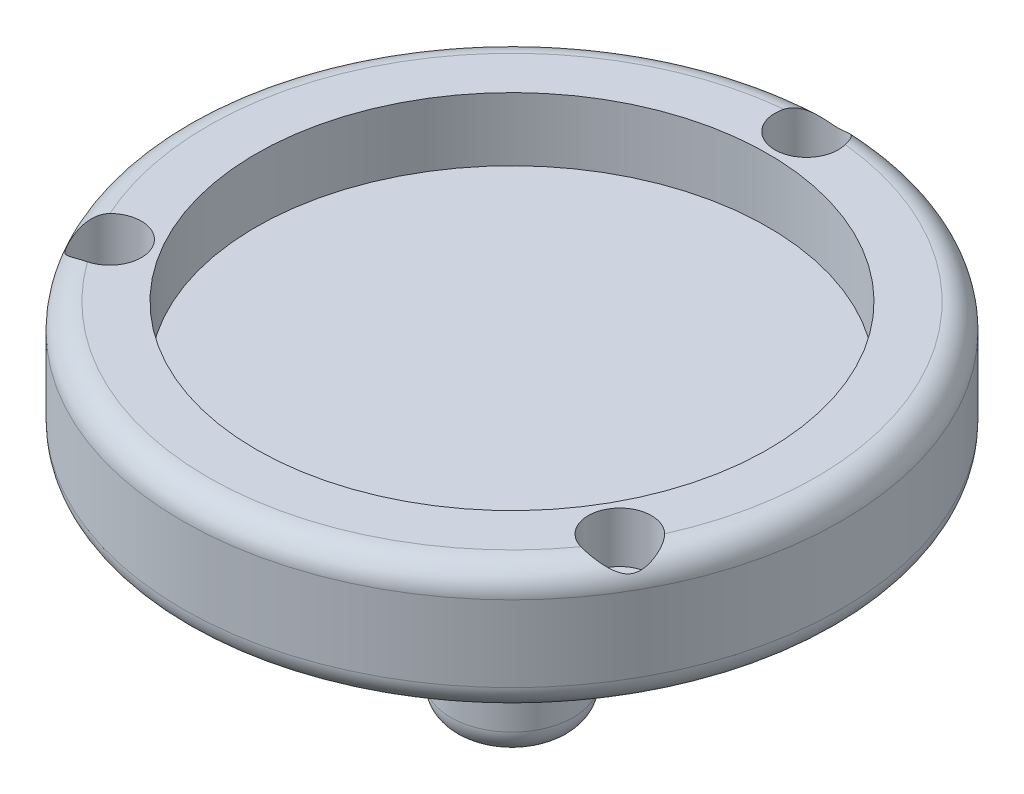
ISO-10303-21;
HEADER;
FILE_DESCRIPTION(('STEP AP214'),'2;1');
FILE_NAME('part.step','',(''),(''),'','','');
FILE_SCHEMA(('AUTOMOTIVE_DESIGN { 1 0 10303 214 1 1 1 1 }'));
ENDSEC;
DATA;
#1=APPLICATION_CONTEXT('core data for automotive mechanical design processes');
#2=APPLICATION_PROTOCOL_DEFINITION('international standard','automotive_design',2000,#1);
#3=PRODUCT_CONTEXT('',#1,'mechanical');
#4=PRODUCT('Part','Part','',(#3));
#5=PRODUCT_RELATED_PRODUCT_CATEGORY('part','',(#4));
#6=PRODUCT_DEFINITION_FORMATION('','',#4);
#7=PRODUCT_DEFINITION_CONTEXT('part definition',#1,'design');
#8=PRODUCT_DEFINITION('design','',#6,#7);
#9=PRODUCT_DEFINITION_SHAPE('','',#8);
#10=(LENGTH_UNIT() NAMED_UNIT(*) SI_UNIT(.MILLI.,.METRE.));
#11=(NAMED_UNIT(*) PLANE_ANGLE_UNIT() SI_UNIT($,.RADIAN.));
#12=(NAMED_UNIT(*) SI_UNIT($,.STERADIAN.) SOLID_ANGLE_UNIT());
#13=UNCERTAINTY_MEASURE_WITH_UNIT(LENGTH_MEASURE(1.E-05),#10,'distance_accuracy_value','');
#14=(GEOMETRIC_REPRESENTATION_CONTEXT(3) GLOBAL_UNCERTAINTY_ASSIGNED_CONTEXT((#13)) GLOBAL_UNIT_ASSIGNED_CONTEXT((#10,
#11,#12)) REPRESENTATION_CONTEXT('',''));
#15=CARTESIAN_POINT('',(0.,0.,0.));
#16=DIRECTION('',(0.,0.,1.));
#17=DIRECTION('',(1.,0.,0.));
#18=AXIS2_PLACEMENT_3D('',#15,#16,#17);
#19=CARTESIAN_POINT('',(0.,6.35,0.));
#20=DIRECTION('',(0.,-1.,0.));
#21=DIRECTION('',(0.,0.,-1.));
#22=AXIS2_PLACEMENT_3D('',#19,#20,#21);
#23=CYLINDRICAL_SURFACE('',#22,16.51);
#24=CARTESIAN_POINT('',(0.,1.27,0.));
#25=DIRECTION('',(0.,1.,0.));
#26=DIRECTION('',(0.,0.,1.));
#27=AXIS2_PLACEMENT_3D('',#24,#25,#26);
#28=CIRCLE('',#27,16.51);
#29=CARTESIAN_POINT('',(0.,1.27,16.51));
#30=VERTEX_POINT('',#29);
#31=EDGE_CURVE('E124',#30,#30,#28,.T.);
#32=ORIENTED_EDGE('',*,*,#31,.T.);
#33=EDGE_LOOP('',(#32));
#34=FACE_BOUND('',#33,.T.);
#35=CARTESIAN_POINT('',(0.,5.08,0.));
#36=DIRECTION('',(0.,1.,0.));
#37=DIRECTION('',(0.,0.,1.));
#38=AXIS2_PLACEMENT_3D('',#35,#36,#37);
#39=CIRCLE('',#38,16.51);
#40=CARTESIAN_POINT('',(0.,5.08,16.51));
#41=VERTEX_POINT('',#40);
#42=EDGE_CURVE('E103',#41,#41,#39,.F.);
#43=ORIENTED_EDGE('',*,*,#42,.T.);
#44=EDGE_LOOP('',(#43));
#45=FACE_BOUND('',#44,.T.);
#46=ADVANCED_FACE('F39',(#34,#45),#23,.T.);
#47=CARTESIAN_POINT('',(0.,6.35,0.));
#48=DIRECTION('',(0.,1.,0.));
#49=DIRECTION('',(0.,0.,1.));
#50=AXIS2_PLACEMENT_3D('',#47,#48,#49);
#51=PLANE('',#50);
#52=CARTESIAN_POINT('',(12.780046674195,6.35,7.37856338760252));
#53=DIRECTION('',(0.,1.,0.));
#54=DIRECTION('',(-0.866025403784436,0.,-0.500000000000004));
#55=AXIS2_PLACEMENT_3D('',#52,#53,#54);
#56=CIRCLE('',#55,1.5875);
#57=CARTESIAN_POINT('',(13.89855472997,6.35,6.25202178643267));
#58=VERTEX_POINT('',#57);
#59=CARTESIAN_POINT('',(12.3636870570494,6.35,8.91049057882617));
#60=VERTEX_POINT('',#59);
#61=EDGE_CURVE('E59',#58,#60,#56,.T.);
#62=ORIENTED_EDGE('',*,*,#61,.F.);
#63=CARTESIAN_POINT('',(0.,6.35,0.));
#64=DIRECTION('',(0.,1.,0.));
#65=DIRECTION('',(0.,0.,1.));
#66=AXIS2_PLACEMENT_3D('',#63,#64,#65);
#67=CIRCLE('',#66,15.24);
#68=CARTESIAN_POINT('',(1.53486767292061,6.35,-15.1625123652587));
#69=VERTEX_POINT('',#68);
#70=EDGE_CURVE('E99',#58,#69,#67,.T.);
#71=ORIENTED_EDGE('',*,*,#70,.T.);
#72=CARTESIAN_POINT('',(0.,6.35,-14.7571267752049));
#73=DIRECTION('',(0.,1.,0.));
#74=DIRECTION('',(0.,0.,1.));
#75=AXIS2_PLACEMENT_3D('',#72,#73,#74);
#76=CIRCLE('',#75,1.5875);
#77=CARTESIAN_POINT('',(-1.53486767292061,6.35,-15.1625123652587));
#78=VERTEX_POINT('',#77);
#79=EDGE_CURVE('E314',#78,#69,#76,.T.);
#80=ORIENTED_EDGE('',*,*,#79,.F.);
#81=CARTESIAN_POINT('',(-13.8985547299701,6.35,6.25202178643247));
#82=VERTEX_POINT('',#81);
#83=EDGE_CURVE('E91',#78,#82,#67,.T.);
#84=ORIENTED_EDGE('',*,*,#83,.T.);
#85=CARTESIAN_POINT('',(-12.7800466741951,6.35,7.37856338760234));
#86=DIRECTION('',(0.,1.,0.));
#87=DIRECTION('',(0.866025403784443,0.,-0.499999999999992));
#88=AXIS2_PLACEMENT_3D('',#85,#86,#87);
#89=CIRCLE('',#88,1.5875);
#90=CARTESIAN_POINT('',(-12.3636870570495,6.35,8.910490578826));
#91=VERTEX_POINT('',#90);
#92=EDGE_CURVE('E66',#91,#82,#89,.T.);
#93=ORIENTED_EDGE('',*,*,#92,.F.);
#94=EDGE_CURVE('E89',#91,#60,#67,.T.);
#95=ORIENTED_EDGE('',*,*,#94,.T.);
#96=EDGE_LOOP('',(#62,#71,#80,#84,#93,#95));
#97=FACE_BOUND('',#96,.T.);
#98=CARTESIAN_POINT('',(0.,6.35,0.));
#99=DIRECTION('',(0.,1.,0.));
#100=DIRECTION('',(0.,0.,1.));
#101=AXIS2_PLACEMENT_3D('',#98,#99,#100);
#102=CIRCLE('',#101,12.827);
#103=CARTESIAN_POINT('',(0.,6.35,12.827));
#104=VERTEX_POINT('',#103);
#105=EDGE_CURVE('E107',#104,#104,#102,.T.);
#106=ORIENTED_EDGE('',*,*,#105,.F.);
#107=EDGE_LOOP('',(#106));
#108=FACE_BOUND('',#107,.T.);
#109=ADVANCED_FACE('F87',(#97,#108),#51,.T.);
#110=CARTESIAN_POINT('',(0.,0.,0.));
#111=DIRECTION('',(0.,1.,0.));
#112=DIRECTION('',(0.,0.,1.));
#113=AXIS2_PLACEMENT_3D('',#110,#111,#112);
#114=PLANE('',#113);
#115=CARTESIAN_POINT('',(0.,0.,0.));
#116=DIRECTION('',(0.,1.,0.));
#117=DIRECTION('',(0.,0.,1.));
#118=AXIS2_PLACEMENT_3D('',#115,#116,#117);
#119=CIRCLE('',#118,15.24);
#120=CARTESIAN_POINT('',(0.,0.,15.24));
#121=VERTEX_POINT('',#120);
#122=EDGE_CURVE('E132',#121,#121,#119,.F.);
#123=ORIENTED_EDGE('',*,*,#122,.T.);
#124=EDGE_LOOP('',(#123));
#125=FACE_BOUND('',#124,.T.);
#126=CARTESIAN_POINT('',(0.,0.,0.));
#127=DIRECTION('',(0.,1.,0.));
#128=DIRECTION('',(0.,0.,1.));
#129=AXIS2_PLACEMENT_3D('',#126,#127,#128);
#130=CIRCLE('',#129,4.3434);
#131=CARTESIAN_POINT('',(0.,0.,4.3434));
#132=VERTEX_POINT('',#131);
#133=EDGE_CURVE('E128',#132,#132,#130,.T.);
#134=ORIENTED_EDGE('',*,*,#133,.T.);
#135=EDGE_LOOP('',(#134));
#136=FACE_BOUND('',#135,.T.);
#137=ADVANCED_FACE('F173',(#125,#136),#114,.F.);
#138=CARTESIAN_POINT('',(0.,3.175,0.));
#139=DIRECTION('',(0.,1.,0.));
#140=DIRECTION('',(0.,0.,1.));
#141=AXIS2_PLACEMENT_3D('',#138,#139,#140);
#142=CYLINDRICAL_SURFACE('',#141,12.827);
#143=CARTESIAN_POINT('',(0.,3.175,0.));
#144=DIRECTION('',(0.,1.,0.));
#145=DIRECTION('',(0.,0.,1.));
#146=AXIS2_PLACEMENT_3D('',#143,#144,#145);
#147=CIRCLE('',#146,12.827);
#148=CARTESIAN_POINT('',(0.,3.175,12.827));
#149=VERTEX_POINT('',#148);
#150=EDGE_CURVE('E104',#149,#149,#147,.T.);
#151=ORIENTED_EDGE('',*,*,#150,.F.);
#152=EDGE_LOOP('',(#151));
#153=FACE_BOUND('',#152,.T.);
#154=ORIENTED_EDGE('',*,*,#105,.T.);
#155=EDGE_LOOP('',(#154));
#156=FACE_BOUND('',#155,.T.);
#157=ADVANCED_FACE('F169',(#153,#156),#142,.F.);
#158=CARTESIAN_POINT('',(0.,3.175,0.));
#159=DIRECTION('',(0.,1.,0.));
#160=DIRECTION('',(0.,0.,1.));
#161=AXIS2_PLACEMENT_3D('',#158,#159,#160);
#162=PLANE('',#161);
#163=ORIENTED_EDGE('',*,*,#150,.T.);
#164=EDGE_LOOP('',(#163));
#165=FACE_BOUND('',#164,.T.);
#166=ADVANCED_FACE('F166',(#165),#162,.T.);
#167=CARTESIAN_POINT('',(0.,5.08,0.));
#168=DIRECTION('',(0.,1.,0.));
#169=DIRECTION('',(0.,0.,1.));
#170=AXIS2_PLACEMENT_3D('',#167,#168,#169);
#171=TOROIDAL_SURFACE('',#170,15.24,1.27);
#172=CARTESIAN_POINT('',(11.3727063344925,5.0798,8.11310366440576));
#173=CARTESIAN_POINT('',(11.372706479442,5.11403589882403,8.11308399126277));
#174=CARTESIAN_POINT('',(11.3734192358844,5.14826580995225,8.1144691623771));
#175=CARTESIAN_POINT('',(11.3762896439657,5.21642591009724,8.11994029689529));
#176=CARTESIAN_POINT('',(11.3784463292933,5.25035628419528,8.1240244540502));
#177=CARTESIAN_POINT('',(11.3842089896516,5.31749867670584,8.1347565741317));
#178=CARTESIAN_POINT('',(11.3878072677039,5.35071353834233,8.14139091356973));
#179=CARTESIAN_POINT('',(11.3964911151178,5.4163763232305,8.15702989954925));
#180=CARTESIAN_POINT('',(11.4015768866258,5.44882414159484,8.16603486823625));
#181=CARTESIAN_POINT('',(11.4191178795051,5.54456463189062,8.19622701891893));
#182=CARTESIAN_POINT('',(11.4338739536247,5.60646416865588,8.22062722483105));
#183=CARTESIAN_POINT('',(11.4701096368497,5.72523980183405,8.27595519534897));
#184=CARTESIAN_POINT('',(11.4916011719239,5.78210675660416,8.30689450636259));
#185=CARTESIAN_POINT('',(11.5438507949829,5.8935933073589,8.37554257840841));
#186=CARTESIAN_POINT('',(11.5751661148188,5.94775383450972,8.41357889369167));
#187=CARTESIAN_POINT('',(11.647166158042,6.04754799479185,8.49191893254162));
#188=CARTESIAN_POINT('',(11.6878447454439,6.09318717685485,8.53222115818537));
#189=CARTESIAN_POINT('',(11.7772483604543,6.17285009987052,8.61061399179455));
#190=CARTESIAN_POINT('',(11.8256172158215,6.20724318749738,8.64873106078568));
#191=CARTESIAN_POINT('',(11.9307903166754,6.26526392850045,8.72131410835895));
#192=CARTESIAN_POINT('',(11.9875826829881,6.28890655473462,8.75578511334675));
#193=CARTESIAN_POINT('',(12.099012881419,6.32214168216185,8.81372947066592));
#194=CARTESIAN_POINT('',(12.1527418614945,6.3332878483285,8.83807449510625));
#195=CARTESIAN_POINT('',(12.2635097476134,6.34748826475938,8.88085090185968));
#196=CARTESIAN_POINT('',(12.3205485692059,6.35054272139166,8.8992824349778));
#197=CARTESIAN_POINT('',(12.4341729795377,6.34932017591593,8.92900134980234));
#198=CARTESIAN_POINT('',(12.4907027220156,6.34529969574203,8.94051920627635));
#199=CARTESIAN_POINT('',(12.6039434421318,6.33139895960008,8.95730556831677));
#200=CARTESIAN_POINT('',(12.6606544815118,6.32151643352116,8.96257165047526));
#201=CARTESIAN_POINT('',(12.7961106863179,6.29195988595494,8.96795501654864));
#202=CARTESIAN_POINT('',(12.8744644535115,6.26994030843277,8.96511807761261));
#203=CARTESIAN_POINT('',(13.0277990255958,6.21920103862342,8.94851700848809));
#204=CARTESIAN_POINT('',(13.1027719568762,6.19046658153389,8.9347286354559));
#205=CARTESIAN_POINT('',(13.2695990730332,6.11976955672689,8.89181392113699));
#206=CARTESIAN_POINT('',(13.3599973794792,6.07639343444513,8.85938652099292));
#207=CARTESIAN_POINT('',(13.5327700394727,5.98747175225542,8.77951138820003));
#208=CARTESIAN_POINT('',(13.6151381274886,5.94192453897291,8.73205204770629));
#209=CARTESIAN_POINT('',(13.7460605593125,5.86921386458075,8.63995955937805));
#210=CARTESIAN_POINT('',(13.7968889644333,5.84089529837038,8.59944245201694));
#211=CARTESIAN_POINT('',(13.8945171862406,5.78936865247123,8.51100767855514));
#212=CARTESIAN_POINT('',(13.9413278591713,5.7661465189103,8.46311100011884));
#213=CARTESIAN_POINT('',(14.0177790118927,5.734599657408,8.3738525423949));
#214=CARTESIAN_POINT('',(14.0485850223939,5.72393042028649,8.33435309549567));
#215=CARTESIAN_POINT('',(14.1067694679432,5.70975846374611,8.25177468377269));
#216=CARTESIAN_POINT('',(14.134156834886,5.70623668604356,8.20870555771149));
#217=CARTESIAN_POINT('',(14.184644876331,5.70716185195011,8.12009331540923));
#218=CARTESIAN_POINT('',(14.207736588275,5.71162525464989,8.07454527729552));
#219=CARTESIAN_POINT('',(14.2490887326299,5.72750564371418,7.98241570000989));
#220=CARTESIAN_POINT('',(14.2673350590226,5.73894261993818,7.93583156208625));
#221=CARTESIAN_POINT('',(14.307885139589,5.77447475829992,7.81648466866069));
#222=CARTESIAN_POINT('',(14.3267590567423,5.80207203701078,7.74363887423819));
#223=CARTESIAN_POINT('',(14.3540300133431,5.86268593130549,7.59819583537799));
#224=CARTESIAN_POINT('',(14.3623883961279,5.89572204071376,7.52560048075421));
#225=CARTESIAN_POINT('',(14.3703189325399,5.97425775906277,7.35686374076847));
#226=CARTESIAN_POINT('',(14.3661262297123,6.02030169268154,7.26078200509495));
#227=CARTESIAN_POINT('',(14.3401431741143,6.10886076032522,7.06949422337727));
#228=CARTESIAN_POINT('',(14.3183899393258,6.15138312911937,6.97428675824069));
#229=CARTESIAN_POINT('',(14.2650797560895,6.21708552282127,6.81299389583945));
#230=CARTESIAN_POINT('',(14.2380201160408,6.2423379596779,6.74627042445876));
#231=CARTESIAN_POINT('',(14.1739982691929,6.28631375418782,6.61545367243004));
#232=CARTESIAN_POINT('',(14.1370498575003,6.30504612439591,6.55135687006102));
#233=CARTESIAN_POINT('',(14.060799646504,6.33110673135582,6.43855738981227));
#234=CARTESIAN_POINT('',(14.0230618092052,6.33986348295954,6.38913326498036));
#235=CARTESIAN_POINT('',(13.9415782949549,6.35000269341416,6.29464358540458));
#236=CARTESIAN_POINT('',(13.8978363792394,6.35138974755598,6.2495753318254));
#237=CARTESIAN_POINT('',(13.8053370197422,6.34566105735002,6.16493901712269));
#238=CARTESIAN_POINT('',(13.7565537952525,6.33849940924226,6.12540193482259));
#239=CARTESIAN_POINT('',(13.6561473852934,6.31501269492,6.05326227042807));
#240=CARTESIAN_POINT('',(13.6045248079944,6.29868958418845,6.02065821055076));
#241=CARTESIAN_POINT('',(13.5054449482992,6.25891609937741,5.96545168545586));
#242=CARTESIAN_POINT('',(13.4580274621348,6.23623254382237,5.94221600144681));
#243=CARTESIAN_POINT('',(13.3644968237113,6.18396782465338,5.90168350312835));
#244=CARTESIAN_POINT('',(13.3183838481225,6.15438573173584,5.88438748973024));
#245=CARTESIAN_POINT('',(13.2265387859798,6.08733973781084,5.85433857327992));
#246=CARTESIAN_POINT('',(13.1809585221195,6.04953931288612,5.84187758005558));
#247=CARTESIAN_POINT('',(13.0942150928541,5.96801826125198,5.82182306557274));
#248=CARTESIAN_POINT('',(13.0530557125961,5.92429263270262,5.81423368814667));
#249=CARTESIAN_POINT('',(12.9707343156006,5.82502138703615,5.80193109271714));
#250=CARTESIAN_POINT('',(12.9304425351488,5.76868158876542,5.79779671301932));
#251=CARTESIAN_POINT('',(12.8587994124516,5.65045833598393,5.79261000609714));
#252=CARTESIAN_POINT('',(12.8274421409264,5.58857859399837,5.79155563054541));
#253=CARTESIAN_POINT('',(12.7870319222845,5.48947238747834,5.79101465619252));
#254=CARTESIAN_POINT('',(12.7742980668449,5.45371495505669,5.79103542620848));
#255=CARTESIAN_POINT('',(12.7522338219916,5.38115733502569,5.79126873457456));
#256=CARTESIAN_POINT('',(12.7429030598979,5.34435726207407,5.79148125191715));
#257=CARTESIAN_POINT('',(12.7278224406278,5.26981062500361,5.7919035002148));
#258=CARTESIAN_POINT('',(12.7220931946291,5.23205987628922,5.79211320852829));
#259=CARTESIAN_POINT('',(12.7144221100984,5.15614291502679,5.79241944730056));
#260=CARTESIAN_POINT('',(12.7124836185035,5.11797636522434,5.79251587771391));
#261=CARTESIAN_POINT('',(12.7125070441582,5.0798,5.79250076324793));
#262=B_SPLINE_CURVE_WITH_KNOTS('',3,(#172,#173,#174,#175,#176,#177,#178,#179,#180,#181,#182,
#183,#184,#185,#186,#187,#188,#189,#190,#191,#192,#193,#194,#195,#196,#197,#198,#199,#200,#201,
#202,#203,#204,#205,#206,#207,#208,#209,#210,#211,#212,#213,#214,#215,#216,#217,#218,#219,#220,
#221,#222,#223,#224,#225,#226,#227,#228,#229,#230,#231,#232,#233,#234,#235,#236,#237,#238,#239,
#240,#241,#242,#243,#244,#245,#246,#247,#248,#249,#250,#251,#252,#253,#254,#255,#256,#257,#258,
#259,#260,#261),.UNSPECIFIED.,.F.,.F.,(4,2,2,2,2,2,2,2,2,2,2,2,2,2,2,2,2,2,2,2,2,2,2,2,2,2,2,2,
2,2,2,2,2,2,2,2,2,2,2,2,2,2,2,2,4),(0.,0.10266174275194,0.205254850420133,0.307307339509473,
0.409373703706885,0.612873735698409,0.816736145078286,1.0353246541934,1.25377032253265,
1.46407892401674,1.67409371121388,1.85326027471167,2.03242226876575,2.20522137976093,
2.37808745192922,2.62105956087341,2.86457103363211,3.17912184359798,3.49391614812391,
3.70615929719089,3.91780960004994,4.07085991944574,4.22350160005699,4.37645826898251,
4.52985546547397,4.76896703816389,5.00895507611625,5.32738562451596,5.64514485796347,
5.87325630370328,6.10105117162491,6.28867631680307,6.47618445671722,6.66470400031026,
6.85318332034445,7.02482795715664,7.19649572962909,7.3773302150226,7.55831831644589,
7.76562908329292,7.97280194866986,8.08653148338878,8.20024855960291,8.31461064214484,
8.42907365187629),.UNSPECIFIED.);
#263=EDGE_CURVE('E11',#60,#58,#262,.T.);
#264=ORIENTED_EDGE('',*,*,#263,.F.);
#265=ORIENTED_EDGE('',*,*,#94,.F.);
#266=CARTESIAN_POINT('',(-12.7125070441583,5.0798,5.79250076324777));
#267=CARTESIAN_POINT('',(-12.7124900791914,5.11403589882402,5.79251072534922));
#268=CARTESIAN_POINT('',(-12.7140460507862,5.14826580995225,5.79243540497786));
#269=CARTESIAN_POINT('',(-12.7202193963072,5.21642591009724,5.79218568403643));
#270=CARTESIAN_POINT('',(-12.7248347228202,5.25035628419528,5.79201134974064));
#271=CARTESIAN_POINT('',(-12.7370103416263,5.31749867670584,5.79163589996354));
#272=CARTESIAN_POINT('',(-12.7445549871432,5.35071353834234,5.79143493044769));
#273=CARTESIAN_POINT('',(-12.7624406699978,5.4163763232305,5.79113586992096));
#274=CARTESIAN_POINT('',(-12.772782087395,5.44882414159485,5.7910377929012));
#275=CARTESIAN_POINT('',(-12.8076997533207,5.54456463189062,5.79113266300094));
#276=CARTESIAN_POINT('',(-12.836208988558,5.60646416865588,5.79171169509263));
#277=CARTESIAN_POINT('',(-12.9022422581789,5.72523980183405,5.79542873203002));
#278=CARTESIAN_POINT('',(-12.9397822550294,5.78210675660416,5.79857129186379));
#279=CARTESIAN_POINT('',(-13.0253580408714,5.8935933073589,5.80949675674809));
#280=CARTESIAN_POINT('',(-13.073956116091,5.94775383450972,5.81759846161203));
#281=CARTESIAN_POINT('',(-13.1778006014801,6.04754799479185,5.84078230869193));
#282=CARTESIAN_POINT('',(-13.2330426464176,6.09318717685486,5.85585988595011));
#283=CARTESIAN_POINT('',(-13.345634639303,6.17285009987052,5.8940892709347));
#284=CARTESIAN_POINT('',(-13.4028294170507,6.20724318749738,5.91691939393914));
#285=CARTESIAN_POINT('',(-13.5182747305602,6.26526392850045,5.97171044728672));
#286=CARTESIAN_POINT('',(-13.57652367973,6.28890655473463,6.00365857676072));
#287=CARTESIAN_POINT('',(-13.6824200643898,6.32214168216185,6.071187780691));
#288=CARTESIAN_POINT('',(-13.7303679640486,6.3332878483285,6.10554593013566));
#289=CARTESIAN_POINT('',(-13.8227973620392,6.34748826475938,6.18008553006142));
#290=CARTESIAN_POINT('',(-13.8672789487464,6.35054272139166,6.22026683200335));
#291=CARTESIAN_POINT('',(-13.9498284891233,6.34932017591593,6.30380900042847));
#292=CARTESIAN_POINT('',(-13.9880681166658,6.34529969574203,6.34700626524669));
#293=CARTESIAN_POINT('',(-14.0592258926881,6.33139895960008,6.43668242459));
#294=CARTESIAN_POINT('',(-14.0921419733057,6.32151643352116,6.4831625842888));
#295=CARTESIAN_POINT('',(-14.1645322074862,6.29195988595494,6.59777941571447));
#296=CARTESIAN_POINT('',(-14.2012522298954,6.26994030843277,6.66705423805433));
#297=CARTESIAN_POINT('',(-14.2635425683457,6.21920103862342,6.80814640731998));
#298=CARTESIAN_POINT('',(-14.2890879526632,6.19046658153389,6.87996905692111));
#299=CARTESIAN_POINT('',(-14.3353362779454,6.11976955672689,7.04590293471264));
#300=CARTESIAN_POINT('',(-14.3524524788649,6.07639343444513,7.140403864626));
#301=CARTESIAN_POINT('',(-14.3696649147324,5.98747175225542,7.32996694365622));
#302=CARTESIAN_POINT('',(-14.3697479642259,5.94192453897292,7.42502947058602));
#303=CARTESIAN_POINT('',(-14.3554547457479,5.86921386458075,7.58445786663488));
#304=CARTESIAN_POINT('',(-14.3457801040457,5.84089529837038,7.6487351103839));
#305=CARTESIAN_POINT('',(-14.3180074545535,5.78936865247123,7.77750101732622));
#306=CARTESIAN_POINT('',(-14.2999330507361,5.76614651891031,7.8419885884706));
#307=CARTESIAN_POINT('',(-14.2608585352053,5.73459965740801,7.95282645773788));
#308=CARTESIAN_POINT('',(-14.2420540160057,5.7239304202865,7.99925496887077));
#309=CARTESIAN_POINT('',(-14.1996312364241,5.70975846374612,8.09093338268306));
#310=CARTESIAN_POINT('',(-14.1760259626077,5.70623668604356,8.13618610122895));
#311=CARTESIAN_POINT('',(-14.1245295304101,5.70716185195012,8.22421614885871));
#312=CARTESIAN_POINT('',(-14.0966296282831,5.7116252546499,8.266988177076));
#313=CARTESIAN_POINT('',(-14.0375191460913,5.72750564371418,8.34886497323108));
#314=CARTESIAN_POINT('',(-14.0062992624324,5.73894261993819,8.38795882437472));
#315=CARTESIAN_POINT('',(-13.9232168611463,5.77447475829993,8.48274967098353));
#316=CARTESIAN_POINT('',(-13.8695675111942,5.80207203701079,8.53551785991845));
#317=CARTESIAN_POINT('',(-13.757245623038,5.8626859313055,8.63185672055036));
#318=CARTESIAN_POINT('',(-13.6985553931295,5.89572204071377,8.67539296968846));
#319=CARTESIAN_POINT('',(-13.5563903579561,5.97425775906278,8.7666293856797));
#320=CARTESIAN_POINT('',(-13.4710847826093,6.02030169268155,8.81103926635726));
#321=CARTESIAN_POINT('',(-13.2924331764092,6.10886076032522,8.88418117100031));
#322=CARTESIAN_POINT('',(-13.1991044755768,6.15138312911938,8.91294604962724));
#323=CARTESIAN_POINT('',(-13.03276566767,6.21708552282128,8.94742450786484));
#324=CARTESIAN_POINT('',(-12.9614516264014,6.24233795967791,8.95735190785579));
#325=CARTESIAN_POINT('',(-12.81615007248,6.28631375418782,8.96731573810267));
#326=CARTESIAN_POINT('',(-12.7421664074807,6.30504612439591,8.96736587613188));
#327=CARTESIAN_POINT('',(-12.6063540865535,6.33110673135582,8.95773099648956));
#328=CARTESIAN_POINT('',(-12.5446826202398,6.33986348295954,8.94976113312079));
#329=CARTESIAN_POINT('',(-12.4221104002066,6.35000269341416,8.92643917957829));
#330=CARTESIAN_POINT('',(-12.3612091898451,6.35138974755598,8.91109169614809));
#331=CARTESIAN_POINT('',(-12.2416623114813,6.34566105735002,8.87330305834113));
#332=CARTESIAN_POINT('',(-12.183030581573,6.33849940924226,8.85082408780457));
#333=CARTESIAN_POINT('',(-12.0703525946073,6.31501269492,8.79993941827443));
#334=CARTESIAN_POINT('',(-12.0163053618375,6.29868958418845,8.77153498486333));
#335=CARTESIAN_POINT('',(-11.9189551788031,6.2589160993774,8.71333257191136));
#336=CARTESIAN_POINT('',(-11.8751237430947,6.23623254382236,8.68388566631387));
#337=CARTESIAN_POINT('',(-11.7932562506604,6.18396782465337,8.62315200656619));
#338=CARTESIAN_POINT('',(-11.755220975879,6.15438573173583,8.59186500496123));
#339=CARTESIAN_POINT('',(-11.6832753198055,6.08733973781083,8.52734930615869));
#340=CARTESIAN_POINT('',(-11.6496936511867,6.04953931288611,8.49410613635659));
#341=CARTESIAN_POINT('',(-11.5889542175513,5.96801826125197,8.42901138024286));
#342=CARTESIAN_POINT('',(-11.5618019337724,5.92429263270261,8.39716100004841));
#343=CARTESIAN_POINT('',(-11.5099868751002,5.82502138703614,8.33201987669009));
#344=CARTESIAN_POINT('',(-11.4862605070271,5.76868158876541,8.29919336110398));
#345=CARTESIAN_POINT('',(-11.4459471257219,5.65045833598391,8.2397419503029));
#346=CARTESIAN_POINT('',(-11.4293553739464,5.58857859399835,8.21311294434457));
#347=CARTESIAN_POINT('',(-11.408681767093,5.48947238747833,8.17838715560465));
#348=CARTESIAN_POINT('',(-11.4023328267347,5.45371495505668,8.16734892829782));
#349=CARTESIAN_POINT('',(-11.3915027552799,5.38115733502568,8.14812407755648));
#350=CARTESIAN_POINT('',(-11.3870214196505,5.34435726207406,8.1399371418754));
#351=CARTESIAN_POINT('',(-11.379846787768,5.26981062500361,8.12666581833392));
#352=CARTESIAN_POINT('',(-11.3771637774955,5.23205987628922,8.12159929159774));
#353=CARTESIAN_POINT('',(-11.3735934457865,5.15614291502679,8.11480281813342));
#354=CARTESIAN_POINT('',(-11.3727077111767,5.11797636522434,8.11307581996055));
#355=CARTESIAN_POINT('',(-11.3727063344926,5.0798,8.11310366440562));
#356=B_SPLINE_CURVE_WITH_KNOTS('',3,(#266,#267,#268,#269,#270,#271,#272,#273,#274,#275,#276,
#277,#278,#279,#280,#281,#282,#283,#284,#285,#286,#287,#288,#289,#290,#291,#292,#293,#294,#295,
#296,#297,#298,#299,#300,#301,#302,#303,#304,#305,#306,#307,#308,#309,#310,#311,#312,#313,#314,
#315,#316,#317,#318,#319,#320,#321,#322,#323,#324,#325,#326,#327,#328,#329,#330,#331,#332,#333,
#334,#335,#336,#337,#338,#339,#340,#341,#342,#343,#344,#345,#346,#347,#348,#349,#350,#351,#352,
#353,#354,#355),.UNSPECIFIED.,.F.,.F.,(4,2,2,2,2,2,2,2,2,2,2,2,2,2,2,2,2,2,2,2,2,2,2,2,2,2,2,2,
2,2,2,2,2,2,2,2,2,2,2,2,2,2,2,2,4),(0.,0.102661742751939,0.205254850420133,0.307307339509475,
0.409373703706886,0.612873735698406,0.816736145078287,1.0353246541934,1.25377032253266,
1.46407892401674,1.67409371121389,1.85326027471168,2.03242226876575,2.20522137976093,
2.37808745192923,2.62105956087341,2.86457103363211,3.17912184359798,3.49391614812391,
3.70615929719089,3.91780960004994,4.07085991944574,4.22350160005699,4.37645826898251,
4.52985546547397,4.7689670381639,5.00895507611626,5.32738562451596,5.64514485796348,
5.87325630370328,6.10105117162491,6.28867631680307,6.47618445671722,6.66470400031026,
6.85318332034445,7.02482795715664,7.19649572962909,7.3773302150226,7.55831831644589,
7.76562908329292,7.97280194866986,8.08653148338878,8.2002485596029,8.31461064214482,
8.42907365187627),.UNSPECIFIED.);
#357=EDGE_CURVE('E54',#82,#91,#356,.T.);
#358=ORIENTED_EDGE('',*,*,#357,.F.);
#359=ORIENTED_EDGE('',*,*,#83,.F.);
#360=CARTESIAN_POINT('',(1.3398007096657,5.0798,-13.9056044276536));
#361=CARTESIAN_POINT('',(1.33978359974934,5.11403589882402,-13.9055947166121));
#362=CARTESIAN_POINT('',(1.34062681490175,5.14826580995225,-13.906904567355));
#363=CARTESIAN_POINT('',(1.34392975234136,5.21642591009724,-13.9121259809318));
#364=CARTESIAN_POINT('',(1.34638839352676,5.25035628419528,-13.9160358037909));
#365=CARTESIAN_POINT('',(1.35280135197467,5.31749867670584,-13.9263924740953));
#366=CARTESIAN_POINT('',(1.35674771943918,5.35071353834234,-13.9328258440175));
#367=CARTESIAN_POINT('',(1.36594955487992,5.4163763232305,-13.9481657694703));
#368=CARTESIAN_POINT('',(1.37120520076916,5.44882414159484,-13.9570726611375));
#369=CARTESIAN_POINT('',(1.3885818738156,5.54456463189062,-13.9873596819199));
#370=CARTESIAN_POINT('',(1.40233503493324,5.60646416865588,-14.0123389199237));
#371=CARTESIAN_POINT('',(1.43213262132909,5.72523980183405,-14.0713839273791));
#372=CARTESIAN_POINT('',(1.44818108310537,5.78210675660416,-14.1054657982265));
#373=CARTESIAN_POINT('',(1.4815072458884,5.8935933073589,-14.1850393351566));
#374=CARTESIAN_POINT('',(1.49879000127208,5.94775383450972,-14.2311773553038));
#375=CARTESIAN_POINT('',(1.53063444343799,6.04754799479185,-14.3327012412336));
#376=CARTESIAN_POINT('',(1.54519790097361,6.09318717685486,-14.3880810441356));
#377=CARTESIAN_POINT('',(1.56838627884861,6.17285009987052,-14.5047032627293));
#378=CARTESIAN_POINT('',(1.57721220122911,6.20724318749738,-14.5656504547249));
#379=CARTESIAN_POINT('',(1.58748441388473,6.26526392850045,-14.6930245556457));
#380=CARTESIAN_POINT('',(1.58894099674176,6.28890655473462,-14.7594436901075));
#381=CARTESIAN_POINT('',(1.58340718297069,6.32214168216185,-14.884917251357));
#382=CARTESIAN_POINT('',(1.57762610255401,6.3332878483285,-14.943620425242));
#383=CARTESIAN_POINT('',(1.55928761442564,6.34748826475938,-15.0609364319212));
#384=CARTESIAN_POINT('',(1.5467303795404,6.35054272139166,-15.1195492669812));
#385=CARTESIAN_POINT('',(1.51565550958544,6.34932017591593,-15.2328103502309));
#386=CARTESIAN_POINT('',(1.49736539465015,6.34529969574203,-15.2875254715231));
#387=CARTESIAN_POINT('',(1.45528245055614,6.33139895960008,-15.3939879929068));
#388=CARTESIAN_POINT('',(1.43148749179384,6.32151643352116,-15.4457342347641));
#389=CARTESIAN_POINT('',(1.36842152116818,6.29195988595494,-15.5657344322632));
#390=CARTESIAN_POINT('',(1.32678777638381,6.26994030843277,-15.632172315667));
#391=CARTESIAN_POINT('',(1.23574354274985,6.21920103862341,-15.7566634158081));
#392=CARTESIAN_POINT('',(1.18631599578691,6.19046658153389,-15.8146976923771));
#393=CARTESIAN_POINT('',(1.06573720491207,6.11976955672689,-15.9377168558497));
#394=CARTESIAN_POINT('',(0.992455099385622,6.07639343444513,-15.999790385619));
#395=CARTESIAN_POINT('',(0.836894875259579,5.98747175225542,-16.1094783318563));
#396=CARTESIAN_POINT('',(0.754609836737192,5.94192453897292,-16.1570815182924));
#397=CARTESIAN_POINT('',(0.609394186435253,5.86921386458075,-16.224417426013));
#398=CARTESIAN_POINT('',(0.548891139612271,5.84089529837038,-16.2481775624009));
#399=CARTESIAN_POINT('',(0.423490268312784,5.78936865247123,-16.2885086958814));
#400=CARTESIAN_POINT('',(0.358605191564701,5.76614651891031,-16.3050995885895));
#401=CARTESIAN_POINT('',(0.243079523312468,5.73459965740801,-16.3266790001328));
#402=CARTESIAN_POINT('',(0.193468993611708,5.7239304202865,-16.3336080643665));
#403=CARTESIAN_POINT('',(0.0928617684807913,5.70975846374612,-16.3427080664558));
#404=CARTESIAN_POINT('',(0.0418691277215677,5.70623668604356,-16.3448916589405));
#405=CARTESIAN_POINT('',(-0.0601153459209597,5.70716185195012,-16.344309464268));
#406=CARTESIAN_POINT('',(-0.111106959992009,5.7116252546499,-16.3415334543716));
#407=CARTESIAN_POINT('',(-0.211569586538715,5.72750564371418,-16.331280673241));
#408=CARTESIAN_POINT('',(-0.26103579659033,5.73894261993818,-16.323790386461));
#409=CARTESIAN_POINT('',(-0.384668278442833,5.77447475829993,-16.2992343396443));
#410=CARTESIAN_POINT('',(-0.45719154554822,5.80207203701078,-16.2791567341567));
#411=CARTESIAN_POINT('',(-0.596784390305173,5.8626859313055,-16.2300525559284));
#412=CARTESIAN_POINT('',(-0.663833002998515,5.89572204071377,-16.2009934504427));
#413=CARTESIAN_POINT('',(-0.813928574583902,5.97425775906278,-16.1234931264482));
#414=CARTESIAN_POINT('',(-0.89504144710308,6.02030169268155,-16.0718212714523));
#415=CARTESIAN_POINT('',(-1.04770999770518,6.10886076032522,-15.9536753943776));
#416=CARTESIAN_POINT('',(-1.11928546374911,6.15138312911938,-15.887232807868));
#417=CARTESIAN_POINT('',(-1.23231408841955,6.21708552282127,-15.7604184037043));
#418=CARTESIAN_POINT('',(-1.27656848963959,6.24233795967791,-15.7036223323146));
#419=CARTESIAN_POINT('',(-1.35784819671307,6.28631375418782,-15.5827694105327));
#420=CARTESIAN_POINT('',(-1.39488345001968,6.30504612439591,-15.5187227461929));
#421=CARTESIAN_POINT('',(-1.45444555995065,6.33110673135582,-15.3962883863019));
#422=CARTESIAN_POINT('',(-1.47837918896545,6.33986348295954,-15.3388943981012));
#423=CARTESIAN_POINT('',(-1.51946789474837,6.35000269341416,-15.2210827649829));
#424=CARTESIAN_POINT('',(-1.53662718939441,6.35138974755598,-15.1606670279735));
#425=CARTESIAN_POINT('',(-1.56367470826107,6.34566105735002,-15.0382420754639));
#426=CARTESIAN_POINT('',(-1.57352321367962,6.33849940924226,-14.9762260226272));
#427=CARTESIAN_POINT('',(-1.58579479068619,6.31501269492,-14.8532016887025));
#428=CARTESIAN_POINT('',(-1.58821944615696,6.29868958418845,-14.7921931954141));
#429=CARTESIAN_POINT('',(-1.58648976949621,6.2589160993774,-14.6787842573673));
#430=CARTESIAN_POINT('',(-1.58290371904013,6.23623254382236,-14.6261016677607));
#431=CARTESIAN_POINT('',(-1.57124057305103,6.18396782465337,-14.5248355096946));
#432=CARTESIAN_POINT('',(-1.56316287224357,6.15438573173583,-14.4762524946915));
#433=CARTESIAN_POINT('',(-1.54326346617442,6.08733973781083,-14.3816878794386));
#434=CARTESIAN_POINT('',(-1.5312648709329,6.04953931288611,-14.3359837164122));
#435=CARTESIAN_POINT('',(-1.50526087530294,5.96801826125196,-14.2508344458156));
#436=CARTESIAN_POINT('',(-1.4912537788238,5.92429263270261,-14.2113946881951));
#437=CARTESIAN_POINT('',(-1.46074744050054,5.82502138703614,-14.1339509694073));
#438=CARTESIAN_POINT('',(-1.4441820281218,5.76868158876541,-14.0969900741233));
#439=CARTESIAN_POINT('',(-1.41285228672982,5.65045833598391,-14.0323519564001));
#440=CARTESIAN_POINT('',(-1.39808676698015,5.58857859399835,-14.00466857489));
#441=CARTESIAN_POINT('',(-1.3783501551916,5.48947238747832,-13.9694018117972));
#442=CARTESIAN_POINT('',(-1.37196524011032,5.45371495505668,-13.9583843545063));
#443=CARTESIAN_POINT('',(-1.36073106671172,5.38115733502568,-13.9393928121311));
#444=CARTESIAN_POINT('',(-1.35588164024746,5.34435726207406,-13.9314183937926));
#445=CARTESIAN_POINT('',(-1.34797565285996,5.2698106250036,-13.9185693185488));
#446=CARTESIAN_POINT('',(-1.34492941713373,5.23205987628922,-13.9137125001261));
#447=CARTESIAN_POINT('',(-1.34082866431196,5.15614291502679,-13.907222265434));
#448=CARTESIAN_POINT('',(-1.33977590732686,5.11797636522434,-13.9055916976745));
#449=CARTESIAN_POINT('',(-1.33980070966571,5.0798,-13.9056044276536));
#450=B_SPLINE_CURVE_WITH_KNOTS('',3,(#360,#361,#362,#363,#364,#365,#366,#367,#368,#369,#370,
#371,#372,#373,#374,#375,#376,#377,#378,#379,#380,#381,#382,#383,#384,#385,#386,#387,#388,#389,
#390,#391,#392,#393,#394,#395,#396,#397,#398,#399,#400,#401,#402,#403,#404,#405,#406,#407,#408,
#409,#410,#411,#412,#413,#414,#415,#416,#417,#418,#419,#420,#421,#422,#423,#424,#425,#426,#427,
#428,#429,#430,#431,#432,#433,#434,#435,#436,#437,#438,#439,#440,#441,#442,#443,#444,#445,#446,
#447,#448,#449),.UNSPECIFIED.,.F.,.F.,(4,2,2,2,2,2,2,2,2,2,2,2,2,2,2,2,2,2,2,2,2,2,2,2,2,2,2,2,
2,2,2,2,2,2,2,2,2,2,2,2,2,2,2,2,4),(0.,0.102661742751939,0.205254850420132,0.307307339509475,
0.409373703706885,0.612873735698406,0.816736145078286,1.0353246541934,1.25377032253265,
1.46407892401674,1.67409371121389,1.85326027471167,2.03242226876575,2.20522137976093,
2.37808745192923,2.62105956087341,2.86457103363212,3.17912184359798,3.49391614812391,
3.70615929719089,3.91780960004994,4.07085991944574,4.22350160005699,4.37645826898251,
4.52985546547397,4.76896703816389,5.00895507611626,5.32738562451596,5.64514485796348,
5.87325630370328,6.10105117162491,6.28867631680307,6.47618445671722,6.66470400031027,
6.85318332034445,7.02482795715665,7.1964957296291,7.37733021502261,7.55831831644589,
7.76562908329293,7.97280194866987,8.08653148338879,8.20024855960291,8.31461064214483,
8.42907365187628),.UNSPECIFIED.);
#451=EDGE_CURVE('E84',#69,#78,#450,.T.);
#452=ORIENTED_EDGE('',*,*,#451,.F.);
#453=ORIENTED_EDGE('',*,*,#70,.F.);
#454=EDGE_LOOP('',(#264,#265,#358,#359,#452,#453));
#455=FACE_BOUND('',#454,.T.);
#456=ORIENTED_EDGE('',*,*,#42,.F.);
#457=EDGE_LOOP('',(#456));
#458=FACE_BOUND('',#457,.T.);
#459=ADVANCED_FACE('F95',(#455,#458),#171,.T.);
#460=CARTESIAN_POINT('',(0.,-11.43,0.));
#461=DIRECTION('',(0.,1.,0.));
#462=DIRECTION('',(0.,0.,1.));
#463=AXIS2_PLACEMENT_3D('',#460,#461,#462);
#464=CYLINDRICAL_SURFACE('',#463,3.0734);
#465=CARTESIAN_POINT('',(0.,-10.16,0.));
#466=DIRECTION('',(0.,-1.,0.));
#467=DIRECTION('',(0.,0.,-1.));
#468=AXIS2_PLACEMENT_3D('',#465,#466,#467);
#469=CIRCLE('',#468,3.0734);
#470=CARTESIAN_POINT('',(0.,-10.16,-3.0734));
#471=VERTEX_POINT('',#470);
#472=EDGE_CURVE('E120',#471,#471,#469,.F.);
#473=ORIENTED_EDGE('',*,*,#472,.T.);
#474=EDGE_LOOP('',(#473));
#475=FACE_BOUND('',#474,.T.);
#476=CARTESIAN_POINT('',(0.,-1.27,0.));
#477=DIRECTION('',(0.,1.,0.));
#478=DIRECTION('',(0.,0.,1.));
#479=AXIS2_PLACEMENT_3D('',#476,#477,#478);
#480=CIRCLE('',#479,3.0734);
#481=CARTESIAN_POINT('',(0.,-1.27,3.0734));
#482=VERTEX_POINT('',#481);
#483=EDGE_CURVE('E116',#482,#482,#480,.F.);
#484=ORIENTED_EDGE('',*,*,#483,.T.);
#485=EDGE_LOOP('',(#484));
#486=FACE_BOUND('',#485,.T.);
#487=ADVANCED_FACE('F161',(#475,#486),#464,.T.);
#488=CARTESIAN_POINT('',(0.,-11.43,0.));
#489=DIRECTION('',(0.,-1.,0.));
#490=DIRECTION('',(0.,0.,-1.));
#491=AXIS2_PLACEMENT_3D('',#488,#489,#490);
#492=PLANE('',#491);
#493=CARTESIAN_POINT('',(0.,-11.43,0.));
#494=DIRECTION('',(0.,-1.,0.));
#495=DIRECTION('',(0.,0.,-1.));
#496=AXIS2_PLACEMENT_3D('',#493,#494,#495);
#497=CIRCLE('',#496,1.8034);
#498=CARTESIAN_POINT('',(0.,-11.43,-1.8034));
#499=VERTEX_POINT('',#498);
#500=EDGE_CURVE('E112',#499,#499,#497,.T.);
#501=ORIENTED_EDGE('',*,*,#500,.T.);
#502=EDGE_LOOP('',(#501));
#503=FACE_BOUND('',#502,.T.);
#504=ADVANCED_FACE('F157',(#503),#492,.T.);
#505=CARTESIAN_POINT('',(0.,-10.16,0.));
#506=DIRECTION('',(0.,-1.,0.));
#507=DIRECTION('',(0.,0.,-1.));
#508=AXIS2_PLACEMENT_3D('',#505,#506,#507);
#509=TOROIDAL_SURFACE('',#508,1.8034,1.27);
#510=ORIENTED_EDGE('',*,*,#472,.F.);
#511=EDGE_LOOP('',(#510));
#512=FACE_BOUND('',#511,.T.);
#513=ORIENTED_EDGE('',*,*,#500,.F.);
#514=EDGE_LOOP('',(#513));
#515=FACE_BOUND('',#514,.T.);
#516=ADVANCED_FACE('F160',(#512,#515),#509,.T.);
#517=CARTESIAN_POINT('',(0.,1.27,0.));
#518=DIRECTION('',(0.,1.,0.));
#519=DIRECTION('',(0.,0.,1.));
#520=AXIS2_PLACEMENT_3D('',#517,#518,#519);
#521=TOROIDAL_SURFACE('',#520,15.24,1.27);
#522=ORIENTED_EDGE('',*,*,#122,.F.);
#523=EDGE_LOOP('',(#522));
#524=FACE_BOUND('',#523,.T.);
#525=ORIENTED_EDGE('',*,*,#31,.F.);
#526=EDGE_LOOP('',(#525));
#527=FACE_BOUND('',#526,.T.);
#528=ADVANCED_FACE('F208',(#524,#527),#521,.T.);
#529=CARTESIAN_POINT('',(0.,-1.27,0.));
#530=DIRECTION('',(0.,1.,0.));
#531=DIRECTION('',(0.,0.,1.));
#532=AXIS2_PLACEMENT_3D('',#529,#530,#531);
#533=TOROIDAL_SURFACE('',#532,4.3434,1.27);
#534=ORIENTED_EDGE('',*,*,#133,.F.);
#535=EDGE_LOOP('',(#534));
#536=FACE_BOUND('',#535,.T.);
#537=ORIENTED_EDGE('',*,*,#483,.F.);
#538=EDGE_LOOP('',(#537));
#539=FACE_BOUND('',#538,.T.);
#540=ADVANCED_FACE('F41',(#536,#539),#533,.F.);
#541=CARTESIAN_POINT('',(0.,3.81,-14.7571267752049));
#542=DIRECTION('',(0.,1.,0.));
#543=DIRECTION('',(0.,0.,1.));
#544=AXIS2_PLACEMENT_3D('',#541,#542,#543);
#545=CYLINDRICAL_SURFACE('',#544,1.5875);
#546=ORIENTED_EDGE('',*,*,#451,.T.);
#547=ORIENTED_EDGE('',*,*,#79,.T.);
#548=EDGE_LOOP('',(#546,#547));
#549=FACE_BOUND('',#548,.T.);
#550=CARTESIAN_POINT('',(0.,3.81,-14.7571267752049));
#551=DIRECTION('',(0.,1.,0.));
#552=DIRECTION('',(0.,0.,1.));
#553=AXIS2_PLACEMENT_3D('',#550,#551,#552);
#554=CIRCLE('',#553,1.5875);
#555=CARTESIAN_POINT('',(0.,3.81,-13.1696267752049));
#556=VERTEX_POINT('',#555);
#557=EDGE_CURVE('E319',#556,#556,#554,.T.);
#558=ORIENTED_EDGE('',*,*,#557,.F.);
#559=EDGE_LOOP('',(#558));
#560=FACE_BOUND('',#559,.T.);
#561=ADVANCED_FACE('F150',(#549,#560),#545,.F.);
#562=CARTESIAN_POINT('',(0.,3.81,-14.7571267752049));
#563=DIRECTION('',(0.,1.,0.));
#564=DIRECTION('',(0.,0.,1.));
#565=AXIS2_PLACEMENT_3D('',#562,#563,#564);
#566=PLANE('',#565);
#567=ORIENTED_EDGE('',*,*,#557,.T.);
#568=EDGE_LOOP('',(#567));
#569=FACE_BOUND('',#568,.T.);
#570=ADVANCED_FACE('F155',(#569),#566,.T.);
#571=CARTESIAN_POINT('',(-12.7800466741951,3.81,7.37856338760234));
#572=DIRECTION('',(0.,1.,0.));
#573=DIRECTION('',(0.,0.,1.));
#574=AXIS2_PLACEMENT_3D('',#571,#572,#573);
#575=CYLINDRICAL_SURFACE('',#574,1.5875);
#576=ORIENTED_EDGE('',*,*,#357,.T.);
#577=ORIENTED_EDGE('',*,*,#92,.T.);
#578=EDGE_LOOP('',(#576,#577));
#579=FACE_BOUND('',#578,.T.);
#580=CARTESIAN_POINT('',(-12.7800466741951,3.81,7.37856338760234));
#581=DIRECTION('',(0.,1.,0.));
#582=DIRECTION('',(0.866025403784443,0.,-0.499999999999992));
#583=AXIS2_PLACEMENT_3D('',#580,#581,#582);
#584=CIRCLE('',#583,1.5875);
#585=CARTESIAN_POINT('',(-11.4052313456872,3.81,6.58481338760235));
#586=VERTEX_POINT('',#585);
#587=EDGE_CURVE('E93',#586,#586,#584,.T.);
#588=ORIENTED_EDGE('',*,*,#587,.F.);
#589=EDGE_LOOP('',(#588));
#590=FACE_BOUND('',#589,.T.);
#591=ADVANCED_FACE('F77',(#579,#590),#575,.F.);
#592=CARTESIAN_POINT('',(-12.7800466741951,3.81,7.37856338760234));
#593=DIRECTION('',(0.,1.,0.));
#594=DIRECTION('',(0.866025403784443,0.,-0.499999999999992));
#595=AXIS2_PLACEMENT_3D('',#592,#593,#594);
#596=PLANE('',#595);
#597=ORIENTED_EDGE('',*,*,#587,.T.);
#598=EDGE_LOOP('',(#597));
#599=FACE_BOUND('',#598,.T.);
#600=ADVANCED_FACE('F236',(#599),#596,.T.);
#601=CARTESIAN_POINT('',(12.780046674195,3.81,7.37856338760252));
#602=DIRECTION('',(0.,1.,0.));
#603=DIRECTION('',(0.,0.,1.));
#604=AXIS2_PLACEMENT_3D('',#601,#602,#603);
#605=CYLINDRICAL_SURFACE('',#604,1.5875);
#606=ORIENTED_EDGE('',*,*,#263,.T.);
#607=ORIENTED_EDGE('',*,*,#61,.T.);
#608=EDGE_LOOP('',(#606,#607));
#609=FACE_BOUND('',#608,.T.);
#610=CARTESIAN_POINT('',(12.780046674195,3.81,7.37856338760252));
#611=DIRECTION('',(0.,1.,0.));
#612=DIRECTION('',(-0.866025403784436,0.,-0.500000000000004));
#613=AXIS2_PLACEMENT_3D('',#610,#611,#612);
#614=CIRCLE('',#613,1.5875);
#615=CARTESIAN_POINT('',(11.4052313456872,3.81,6.58481338760251));
#616=VERTEX_POINT('',#615);
#617=EDGE_CURVE('E311',#616,#616,#614,.T.);
#618=ORIENTED_EDGE('',*,*,#617,.F.);
#619=EDGE_LOOP('',(#618));
#620=FACE_BOUND('',#619,.T.);
#621=ADVANCED_FACE('F242',(#609,#620),#605,.F.);
#622=CARTESIAN_POINT('',(12.780046674195,3.81,7.37856338760252));
#623=DIRECTION('',(0.,1.,0.));
#624=DIRECTION('',(-0.866025403784436,0.,-0.500000000000004));
#625=AXIS2_PLACEMENT_3D('',#622,#623,#624);
#626=PLANE('',#625);
#627=ORIENTED_EDGE('',*,*,#617,.T.);
#628=EDGE_LOOP('',(#627));
#629=FACE_BOUND('',#628,.T.);
#630=ADVANCED_FACE('F250',(#629),#626,.T.);
#631=CLOSED_SHELL('',(#46,#109,#137,#157,#166,#459,#487,#504,#516,#528,#540,#561,#570,#591,#600,
#621,#630));
#632=MANIFOLD_SOLID_BREP('B2',#631);
#633=ADVANCED_BREP_SHAPE_REPRESENTATION('',(#18,#632),#14);
#634=SHAPE_DEFINITION_REPRESENTATION(#9,#633);
ENDSEC;
END-ISO-10303-21;
